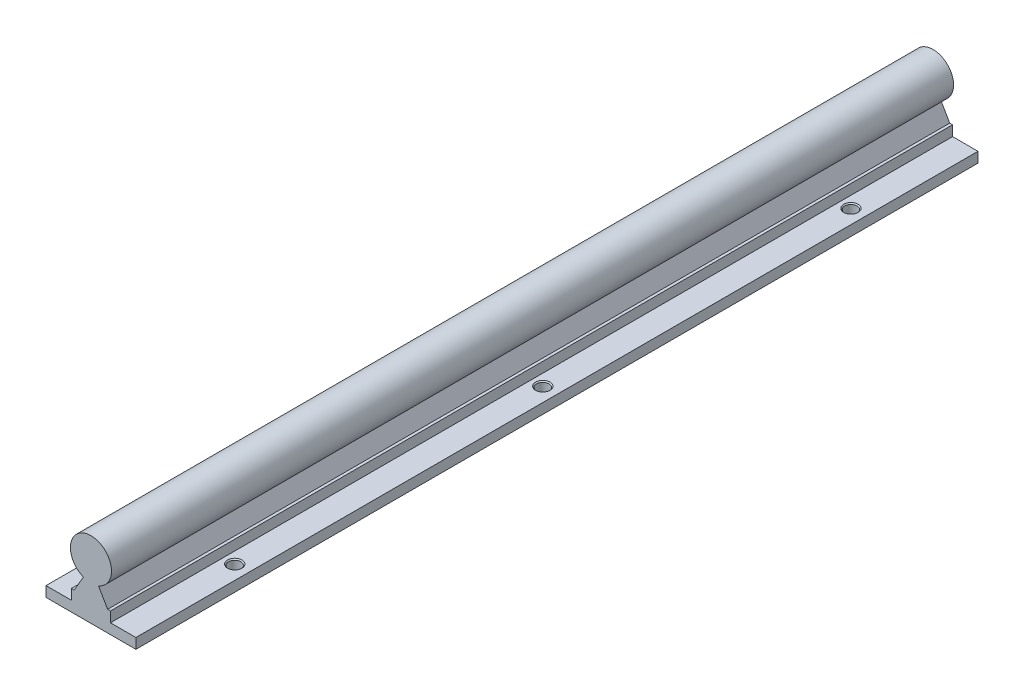
ISO-10303-21;
HEADER;
FILE_DESCRIPTION(('STEP AP214'),'2;1');
FILE_NAME('part.step','',(''),(''),'','','');
FILE_SCHEMA(('AUTOMOTIVE_DESIGN { 1 0 10303 214 1 1 1 1 }'));
ENDSEC;
DATA;
#1=APPLICATION_CONTEXT('core data for automotive mechanical design processes');
#2=APPLICATION_PROTOCOL_DEFINITION('international standard','automotive_design',2000,#1);
#3=PRODUCT_CONTEXT('',#1,'mechanical');
#4=PRODUCT('Part','Part','',(#3));
#5=PRODUCT_RELATED_PRODUCT_CATEGORY('part','',(#4));
#6=PRODUCT_DEFINITION_FORMATION('','',#4);
#7=PRODUCT_DEFINITION_CONTEXT('part definition',#1,'design');
#8=PRODUCT_DEFINITION('design','',#6,#7);
#9=PRODUCT_DEFINITION_SHAPE('','',#8);
#10=(LENGTH_UNIT() NAMED_UNIT(*) SI_UNIT(.MILLI.,.METRE.));
#11=(NAMED_UNIT(*) PLANE_ANGLE_UNIT() SI_UNIT($,.RADIAN.));
#12=(NAMED_UNIT(*) SI_UNIT($,.STERADIAN.) SOLID_ANGLE_UNIT());
#13=UNCERTAINTY_MEASURE_WITH_UNIT(LENGTH_MEASURE(1.E-05),#10,'distance_accuracy_value','');
#14=(GEOMETRIC_REPRESENTATION_CONTEXT(3) GLOBAL_UNCERTAINTY_ASSIGNED_CONTEXT((#13)) GLOBAL_UNIT_ASSIGNED_CONTEXT((#10,
#11,#12)) REPRESENTATION_CONTEXT('',''));
#15=CARTESIAN_POINT('',(0.,0.,0.));
#16=DIRECTION('',(0.,0.,1.));
#17=DIRECTION('',(1.,0.,0.));
#18=AXIS2_PLACEMENT_3D('',#15,#16,#17);
#19=CARTESIAN_POINT('',(-8.12119226265795,10.,205.));
#20=DIRECTION('',(0.,-1.,0.));
#21=DIRECTION('',(0.,0.,-1.));
#22=AXIS2_PLACEMENT_3D('',#19,#20,#21);
#23=PLANE('',#22);
#24=DIRECTION('',(-1.,0.,0.));
#25=VECTOR('',#24,1.);
#26=CARTESIAN_POINT('',(-8.12119226265795,10.,-205.));
#27=LINE('',#26,#25);
#28=CARTESIAN_POINT('',(-8.12119226265795,10.,-205.));
#29=VERTEX_POINT('',#28);
#30=CARTESIAN_POINT('',(-9.5,10.,-205.));
#31=VERTEX_POINT('',#30);
#32=EDGE_CURVE('E163',#29,#31,#27,.T.);
#33=ORIENTED_EDGE('',*,*,#32,.T.);
#34=DIRECTION('',(0.,0.,-1.));
#35=VECTOR('',#34,1.);
#36=CARTESIAN_POINT('',(-9.5,10.,205.));
#37=LINE('',#36,#35);
#38=CARTESIAN_POINT('',(-9.5,10.,205.));
#39=VERTEX_POINT('',#38);
#40=EDGE_CURVE('E211',#39,#31,#37,.T.);
#41=ORIENTED_EDGE('',*,*,#40,.F.);
#42=DIRECTION('',(-1.,0.,0.));
#43=VECTOR('',#42,1.);
#44=CARTESIAN_POINT('',(-8.12119226265795,10.,205.));
#45=LINE('',#44,#43);
#46=CARTESIAN_POINT('',(-8.12119226265795,10.,205.));
#47=VERTEX_POINT('',#46);
#48=EDGE_CURVE('E186',#47,#39,#45,.T.);
#49=ORIENTED_EDGE('',*,*,#48,.F.);
#50=DIRECTION('',(0.,0.,-1.));
#51=VECTOR('',#50,1.);
#52=CARTESIAN_POINT('',(-8.12119226265795,10.,205.));
#53=LINE('',#52,#51);
#54=EDGE_CURVE('E159',#47,#29,#53,.T.);
#55=ORIENTED_EDGE('',*,*,#54,.T.);
#56=EDGE_LOOP('',(#33,#41,#49,#55));
#57=FACE_BOUND('',#56,.T.);
#58=ADVANCED_FACE('F40',(#57),#23,.F.);
#59=CARTESIAN_POINT('',(-9.5,10.,205.));
#60=DIRECTION('',(1.,0.,0.));
#61=DIRECTION('',(0.,1.,0.));
#62=AXIS2_PLACEMENT_3D('',#59,#60,#61);
#63=PLANE('',#62);
#64=DIRECTION('',(0.,-1.,0.));
#65=VECTOR('',#64,1.);
#66=CARTESIAN_POINT('',(-9.5,10.,-205.));
#67=LINE('',#66,#65);
#68=CARTESIAN_POINT('',(-9.5,5.,-205.));
#69=VERTEX_POINT('',#68);
#70=EDGE_CURVE('E166',#31,#69,#67,.T.);
#71=ORIENTED_EDGE('',*,*,#70,.T.);
#72=DIRECTION('',(0.,0.,-1.));
#73=VECTOR('',#72,1.);
#74=CARTESIAN_POINT('',(-9.5,5.,205.));
#75=LINE('',#74,#73);
#76=CARTESIAN_POINT('',(-9.5,5.,205.));
#77=VERTEX_POINT('',#76);
#78=EDGE_CURVE('E208',#77,#69,#75,.T.);
#79=ORIENTED_EDGE('',*,*,#78,.F.);
#80=DIRECTION('',(0.,-1.,0.));
#81=VECTOR('',#80,1.);
#82=CARTESIAN_POINT('',(-9.5,10.,205.));
#83=LINE('',#82,#81);
#84=EDGE_CURVE('E114',#39,#77,#83,.T.);
#85=ORIENTED_EDGE('',*,*,#84,.F.);
#86=ORIENTED_EDGE('',*,*,#40,.T.);
#87=EDGE_LOOP('',(#71,#79,#85,#86));
#88=FACE_BOUND('',#87,.T.);
#89=ADVANCED_FACE('F263',(#88),#63,.F.);
#90=CARTESIAN_POINT('',(-9.5,5.,205.));
#91=DIRECTION('',(0.,-1.,0.));
#92=DIRECTION('',(1.,0.,0.));
#93=AXIS2_PLACEMENT_3D('',#90,#91,#92);
#94=PLANE('',#93);
#95=CARTESIAN_POINT('',(-15.,5.,150.));
#96=DIRECTION('',(0.,-1.,0.));
#97=DIRECTION('',(1.,0.,0.));
#98=AXIS2_PLACEMENT_3D('',#95,#96,#97);
#99=CIRCLE('',#98,3.50000000000056);
#100=CARTESIAN_POINT('',(-11.4999999999994,5.,150.));
#101=VERTEX_POINT('',#100);
#102=EDGE_CURVE('E222',#101,#101,#99,.T.);
#103=ORIENTED_EDGE('',*,*,#102,.T.);
#104=EDGE_LOOP('',(#103));
#105=FACE_BOUND('',#104,.T.);
#106=CARTESIAN_POINT('',(-15.,5.,0.));
#107=DIRECTION('',(0.,-1.,0.));
#108=DIRECTION('',(1.,0.,0.));
#109=AXIS2_PLACEMENT_3D('',#106,#107,#108);
#110=CIRCLE('',#109,3.50000000000056);
#111=CARTESIAN_POINT('',(-11.4999999999994,5.,0.));
#112=VERTEX_POINT('',#111);
#113=EDGE_CURVE('E219',#112,#112,#110,.T.);
#114=ORIENTED_EDGE('',*,*,#113,.T.);
#115=EDGE_LOOP('',(#114));
#116=FACE_BOUND('',#115,.T.);
#117=CARTESIAN_POINT('',(-15.,5.,-150.));
#118=DIRECTION('',(0.,-1.,0.));
#119=DIRECTION('',(1.,0.,0.));
#120=AXIS2_PLACEMENT_3D('',#117,#118,#119);
#121=CIRCLE('',#120,3.50000000000001);
#122=CARTESIAN_POINT('',(-11.4999999999999,5.,-150.));
#123=VERTEX_POINT('',#122);
#124=EDGE_CURVE('E216',#123,#123,#121,.T.);
#125=ORIENTED_EDGE('',*,*,#124,.T.);
#126=EDGE_LOOP('',(#125));
#127=FACE_BOUND('',#126,.T.);
#128=DIRECTION('',(-1.,0.,0.));
#129=VECTOR('',#128,1.);
#130=CARTESIAN_POINT('',(-9.5,5.,-205.));
#131=LINE('',#130,#129);
#132=CARTESIAN_POINT('',(-21.88,5.,-205.));
#133=VERTEX_POINT('',#132);
#134=EDGE_CURVE('E169',#69,#133,#131,.T.);
#135=ORIENTED_EDGE('',*,*,#134,.T.);
#136=DIRECTION('',(0.,0.,-1.));
#137=VECTOR('',#136,1.);
#138=CARTESIAN_POINT('',(-21.88,5.,205.));
#139=LINE('',#138,#137);
#140=CARTESIAN_POINT('',(-21.88,5.,205.));
#141=VERTEX_POINT('',#140);
#142=EDGE_CURVE('E205',#141,#133,#139,.T.);
#143=ORIENTED_EDGE('',*,*,#142,.F.);
#144=DIRECTION('',(-1.,0.,0.));
#145=VECTOR('',#144,1.);
#146=CARTESIAN_POINT('',(-9.5,5.,205.));
#147=LINE('',#146,#145);
#148=EDGE_CURVE('E333',#77,#141,#147,.T.);
#149=ORIENTED_EDGE('',*,*,#148,.F.);
#150=ORIENTED_EDGE('',*,*,#78,.T.);
#151=EDGE_LOOP('',(#135,#143,#149,#150));
#152=FACE_BOUND('',#151,.T.);
#153=ADVANCED_FACE('F269',(#105,#116,#127,#152),#94,.F.);
#154=CARTESIAN_POINT('',(-21.88,5.,205.));
#155=DIRECTION('',(1.,0.,0.));
#156=DIRECTION('',(0.,0.,-1.));
#157=AXIS2_PLACEMENT_3D('',#154,#155,#156);
#158=PLANE('',#157);
#159=DIRECTION('',(0.,-1.,0.));
#160=VECTOR('',#159,1.);
#161=CARTESIAN_POINT('',(-21.88,5.,-205.));
#162=LINE('',#161,#160);
#163=CARTESIAN_POINT('',(-21.88,0.,-205.));
#164=VERTEX_POINT('',#163);
#165=EDGE_CURVE('E171',#133,#164,#162,.T.);
#166=ORIENTED_EDGE('',*,*,#165,.T.);
#167=DIRECTION('',(0.,0.,-1.));
#168=VECTOR('',#167,1.);
#169=CARTESIAN_POINT('',(-21.88,0.,205.));
#170=LINE('',#169,#168);
#171=CARTESIAN_POINT('',(-21.88,0.,205.));
#172=VERTEX_POINT('',#171);
#173=EDGE_CURVE('E202',#172,#164,#170,.T.);
#174=ORIENTED_EDGE('',*,*,#173,.F.);
#175=DIRECTION('',(0.,-1.,0.));
#176=VECTOR('',#175,1.);
#177=CARTESIAN_POINT('',(-21.88,5.,205.));
#178=LINE('',#177,#176);
#179=EDGE_CURVE('E335',#141,#172,#178,.T.);
#180=ORIENTED_EDGE('',*,*,#179,.F.);
#181=ORIENTED_EDGE('',*,*,#142,.T.);
#182=EDGE_LOOP('',(#166,#174,#180,#181));
#183=FACE_BOUND('',#182,.T.);
#184=ADVANCED_FACE('F388',(#183),#158,.F.);
#185=CARTESIAN_POINT('',(-21.88,0.,205.));
#186=DIRECTION('',(0.,1.,0.));
#187=DIRECTION('',(0.,0.,1.));
#188=AXIS2_PLACEMENT_3D('',#185,#186,#187);
#189=PLANE('',#188);
#190=CARTESIAN_POINT('',(-15.,0.,150.));
#191=DIRECTION('',(0.,-1.,0.));
#192=DIRECTION('',(0.,0.,-1.));
#193=AXIS2_PLACEMENT_3D('',#190,#191,#192);
#194=CIRCLE('',#193,3.00000000000053);
#195=CARTESIAN_POINT('',(-15.,0.,146.999999999999));
#196=VERTEX_POINT('',#195);
#197=EDGE_CURVE('E321',#196,#196,#194,.T.);
#198=ORIENTED_EDGE('',*,*,#197,.F.);
#199=EDGE_LOOP('',(#198));
#200=FACE_BOUND('',#199,.T.);
#201=CARTESIAN_POINT('',(-15.,0.,0.));
#202=DIRECTION('',(0.,-1.,0.));
#203=DIRECTION('',(0.,0.,-1.));
#204=AXIS2_PLACEMENT_3D('',#201,#202,#203);
#205=CIRCLE('',#204,3.00000000000053);
#206=CARTESIAN_POINT('',(-15.,0.,-3.00000000000053));
#207=VERTEX_POINT('',#206);
#208=EDGE_CURVE('E324',#207,#207,#205,.T.);
#209=ORIENTED_EDGE('',*,*,#208,.F.);
#210=EDGE_LOOP('',(#209));
#211=FACE_BOUND('',#210,.T.);
#212=CARTESIAN_POINT('',(15.,0.,0.));
#213=DIRECTION('',(0.,-1.,0.));
#214=DIRECTION('',(0.,0.,-1.));
#215=AXIS2_PLACEMENT_3D('',#212,#213,#214);
#216=CIRCLE('',#215,2.99999999999948);
#217=CARTESIAN_POINT('',(15.,0.,-2.99999999999948));
#218=VERTEX_POINT('',#217);
#219=EDGE_CURVE('E318',#218,#218,#216,.T.);
#220=ORIENTED_EDGE('',*,*,#219,.F.);
#221=EDGE_LOOP('',(#220));
#222=FACE_BOUND('',#221,.T.);
#223=CARTESIAN_POINT('',(15.,0.,-150.));
#224=DIRECTION('',(0.,-1.,0.));
#225=DIRECTION('',(0.,0.,-1.));
#226=AXIS2_PLACEMENT_3D('',#223,#224,#225);
#227=CIRCLE('',#226,3.00000000000001);
#228=CARTESIAN_POINT('',(15.,0.,-153.));
#229=VERTEX_POINT('',#228);
#230=EDGE_CURVE('E315',#229,#229,#227,.T.);
#231=ORIENTED_EDGE('',*,*,#230,.F.);
#232=EDGE_LOOP('',(#231));
#233=FACE_BOUND('',#232,.T.);
#234=CARTESIAN_POINT('',(-15.,0.,-150.));
#235=DIRECTION('',(0.,-1.,0.));
#236=DIRECTION('',(0.,0.,-1.));
#237=AXIS2_PLACEMENT_3D('',#234,#235,#236);
#238=CIRCLE('',#237,3.00000000000001);
#239=CARTESIAN_POINT('',(-15.,0.,-153.));
#240=VERTEX_POINT('',#239);
#241=EDGE_CURVE('E313',#240,#240,#238,.T.);
#242=ORIENTED_EDGE('',*,*,#241,.F.);
#243=EDGE_LOOP('',(#242));
#244=FACE_BOUND('',#243,.T.);
#245=CARTESIAN_POINT('',(15.,0.,150.));
#246=DIRECTION('',(0.,-1.,0.));
#247=DIRECTION('',(0.,0.,-1.));
#248=AXIS2_PLACEMENT_3D('',#245,#246,#247);
#249=CIRCLE('',#248,2.99999999999947);
#250=CARTESIAN_POINT('',(15.,0.,147.000000000001));
#251=VERTEX_POINT('',#250);
#252=EDGE_CURVE('E167',#251,#251,#249,.T.);
#253=ORIENTED_EDGE('',*,*,#252,.F.);
#254=EDGE_LOOP('',(#253));
#255=FACE_BOUND('',#254,.T.);
#256=DIRECTION('',(1.,0.,0.));
#257=VECTOR('',#256,1.);
#258=CARTESIAN_POINT('',(-21.88,0.,-205.));
#259=LINE('',#258,#257);
#260=CARTESIAN_POINT('',(21.88,0.,-205.));
#261=VERTEX_POINT('',#260);
#262=EDGE_CURVE('E173',#164,#261,#259,.T.);
#263=ORIENTED_EDGE('',*,*,#262,.T.);
#264=DIRECTION('',(0.,0.,-1.));
#265=VECTOR('',#264,1.);
#266=CARTESIAN_POINT('',(21.88,0.,205.));
#267=LINE('',#266,#265);
#268=CARTESIAN_POINT('',(21.88,0.,205.));
#269=VERTEX_POINT('',#268);
#270=EDGE_CURVE('E199',#269,#261,#267,.T.);
#271=ORIENTED_EDGE('',*,*,#270,.F.);
#272=DIRECTION('',(1.,0.,0.));
#273=VECTOR('',#272,1.);
#274=CARTESIAN_POINT('',(-21.88,0.,205.));
#275=LINE('',#274,#273);
#276=EDGE_CURVE('E337',#172,#269,#275,.T.);
#277=ORIENTED_EDGE('',*,*,#276,.F.);
#278=ORIENTED_EDGE('',*,*,#173,.T.);
#279=EDGE_LOOP('',(#263,#271,#277,#278));
#280=FACE_BOUND('',#279,.T.);
#281=ADVANCED_FACE('F384',(#200,#211,#222,#233,#244,#255,#280),#189,.F.);
#282=CARTESIAN_POINT('',(21.88,5.,205.));
#283=DIRECTION('',(-1.,0.,0.));
#284=DIRECTION('',(0.,0.,1.));
#285=AXIS2_PLACEMENT_3D('',#282,#283,#284);
#286=PLANE('',#285);
#287=DIRECTION('',(0.,1.,0.));
#288=VECTOR('',#287,1.);
#289=CARTESIAN_POINT('',(21.88,5.,-205.));
#290=LINE('',#289,#288);
#291=CARTESIAN_POINT('',(21.88,5.,-205.));
#292=VERTEX_POINT('',#291);
#293=EDGE_CURVE('E175',#261,#292,#290,.T.);
#294=ORIENTED_EDGE('',*,*,#293,.T.);
#295=DIRECTION('',(0.,0.,-1.));
#296=VECTOR('',#295,1.);
#297=CARTESIAN_POINT('',(21.88,5.,205.));
#298=LINE('',#297,#296);
#299=CARTESIAN_POINT('',(21.88,5.,205.));
#300=VERTEX_POINT('',#299);
#301=EDGE_CURVE('E196',#300,#292,#298,.T.);
#302=ORIENTED_EDGE('',*,*,#301,.F.);
#303=DIRECTION('',(0.,1.,0.));
#304=VECTOR('',#303,1.);
#305=CARTESIAN_POINT('',(21.88,5.,205.));
#306=LINE('',#305,#304);
#307=EDGE_CURVE('E339',#269,#300,#306,.T.);
#308=ORIENTED_EDGE('',*,*,#307,.F.);
#309=ORIENTED_EDGE('',*,*,#270,.T.);
#310=EDGE_LOOP('',(#294,#302,#308,#309));
#311=FACE_BOUND('',#310,.T.);
#312=ADVANCED_FACE('F380',(#311),#286,.F.);
#313=CARTESIAN_POINT('',(9.5,5.,205.));
#314=DIRECTION('',(0.,-1.,0.));
#315=DIRECTION('',(1.,0.,0.));
#316=AXIS2_PLACEMENT_3D('',#313,#314,#315);
#317=PLANE('',#316);
#318=CARTESIAN_POINT('',(15.,5.,-150.));
#319=DIRECTION('',(0.,-1.,0.));
#320=DIRECTION('',(1.,0.,0.));
#321=AXIS2_PLACEMENT_3D('',#318,#319,#320);
#322=CIRCLE('',#321,3.5);
#323=CARTESIAN_POINT('',(18.5,5.,-150.));
#324=VERTEX_POINT('',#323);
#325=EDGE_CURVE('E240',#324,#324,#322,.T.);
#326=ORIENTED_EDGE('',*,*,#325,.T.);
#327=EDGE_LOOP('',(#326));
#328=FACE_BOUND('',#327,.T.);
#329=CARTESIAN_POINT('',(15.,5.,0.));
#330=DIRECTION('',(0.,-1.,0.));
#331=DIRECTION('',(1.,0.,0.));
#332=AXIS2_PLACEMENT_3D('',#329,#330,#331);
#333=CIRCLE('',#332,3.49999999999945);
#334=CARTESIAN_POINT('',(18.4999999999995,5.,0.));
#335=VERTEX_POINT('',#334);
#336=EDGE_CURVE('E237',#335,#335,#333,.T.);
#337=ORIENTED_EDGE('',*,*,#336,.T.);
#338=EDGE_LOOP('',(#337));
#339=FACE_BOUND('',#338,.T.);
#340=CARTESIAN_POINT('',(15.,5.,150.));
#341=DIRECTION('',(0.,-1.,0.));
#342=DIRECTION('',(1.,0.,0.));
#343=AXIS2_PLACEMENT_3D('',#340,#341,#342);
#344=CIRCLE('',#343,3.49999999999945);
#345=CARTESIAN_POINT('',(18.4999999999994,5.,150.));
#346=VERTEX_POINT('',#345);
#347=EDGE_CURVE('E234',#346,#346,#344,.T.);
#348=ORIENTED_EDGE('',*,*,#347,.T.);
#349=EDGE_LOOP('',(#348));
#350=FACE_BOUND('',#349,.T.);
#351=DIRECTION('',(-1.,0.,0.));
#352=VECTOR('',#351,1.);
#353=CARTESIAN_POINT('',(9.5,5.,-205.));
#354=LINE('',#353,#352);
#355=CARTESIAN_POINT('',(9.5,5.,-205.));
#356=VERTEX_POINT('',#355);
#357=EDGE_CURVE('E177',#292,#356,#354,.T.);
#358=ORIENTED_EDGE('',*,*,#357,.T.);
#359=DIRECTION('',(0.,0.,-1.));
#360=VECTOR('',#359,1.);
#361=CARTESIAN_POINT('',(9.5,5.,205.));
#362=LINE('',#361,#360);
#363=CARTESIAN_POINT('',(9.5,5.,205.));
#364=VERTEX_POINT('',#363);
#365=EDGE_CURVE('E193',#364,#356,#362,.T.);
#366=ORIENTED_EDGE('',*,*,#365,.F.);
#367=DIRECTION('',(-1.,0.,0.));
#368=VECTOR('',#367,1.);
#369=CARTESIAN_POINT('',(9.5,5.,205.));
#370=LINE('',#369,#368);
#371=EDGE_CURVE('E341',#300,#364,#370,.T.);
#372=ORIENTED_EDGE('',*,*,#371,.F.);
#373=ORIENTED_EDGE('',*,*,#301,.T.);
#374=EDGE_LOOP('',(#358,#366,#372,#373));
#375=FACE_BOUND('',#374,.T.);
#376=ADVANCED_FACE('F377',(#328,#339,#350,#375),#317,.F.);
#377=CARTESIAN_POINT('',(9.5,10.,205.));
#378=DIRECTION('',(-1.,0.,0.));
#379=DIRECTION('',(0.,-1.,0.));
#380=AXIS2_PLACEMENT_3D('',#377,#378,#379);
#381=PLANE('',#380);
#382=DIRECTION('',(0.,1.,0.));
#383=VECTOR('',#382,1.);
#384=CARTESIAN_POINT('',(9.5,10.,-205.));
#385=LINE('',#384,#383);
#386=CARTESIAN_POINT('',(9.5,10.,-205.));
#387=VERTEX_POINT('',#386);
#388=EDGE_CURVE('E179',#356,#387,#385,.T.);
#389=ORIENTED_EDGE('',*,*,#388,.T.);
#390=DIRECTION('',(0.,0.,-1.));
#391=VECTOR('',#390,1.);
#392=CARTESIAN_POINT('',(9.5,10.,205.));
#393=LINE('',#392,#391);
#394=CARTESIAN_POINT('',(9.5,10.,205.));
#395=VERTEX_POINT('',#394);
#396=EDGE_CURVE('E190',#395,#387,#393,.T.);
#397=ORIENTED_EDGE('',*,*,#396,.F.);
#398=DIRECTION('',(0.,1.,0.));
#399=VECTOR('',#398,1.);
#400=CARTESIAN_POINT('',(9.5,10.,205.));
#401=LINE('',#400,#399);
#402=EDGE_CURVE('E343',#364,#395,#401,.T.);
#403=ORIENTED_EDGE('',*,*,#402,.F.);
#404=ORIENTED_EDGE('',*,*,#365,.T.);
#405=EDGE_LOOP('',(#389,#397,#403,#404));
#406=FACE_BOUND('',#405,.T.);
#407=ADVANCED_FACE('F349',(#406),#381,.F.);
#408=CARTESIAN_POINT('',(8.12119226265795,10.,205.));
#409=DIRECTION('',(0.,-1.,0.));
#410=DIRECTION('',(0.,0.,-1.));
#411=AXIS2_PLACEMENT_3D('',#408,#409,#410);
#412=PLANE('',#411);
#413=DIRECTION('',(-1.,0.,0.));
#414=VECTOR('',#413,1.);
#415=CARTESIAN_POINT('',(8.12119226265795,10.,-205.));
#416=LINE('',#415,#414);
#417=CARTESIAN_POINT('',(8.12119226265795,10.,-205.));
#418=VERTEX_POINT('',#417);
#419=EDGE_CURVE('E181',#387,#418,#416,.T.);
#420=ORIENTED_EDGE('',*,*,#419,.T.);
#421=DIRECTION('',(0.,0.,-1.));
#422=VECTOR('',#421,1.);
#423=CARTESIAN_POINT('',(8.12119226265795,10.,205.));
#424=LINE('',#423,#422);
#425=CARTESIAN_POINT('',(8.12119226265795,10.,205.));
#426=VERTEX_POINT('',#425);
#427=EDGE_CURVE('E154',#426,#418,#424,.T.);
#428=ORIENTED_EDGE('',*,*,#427,.F.);
#429=DIRECTION('',(-1.,0.,0.));
#430=VECTOR('',#429,1.);
#431=CARTESIAN_POINT('',(8.12119226265795,10.,205.));
#432=LINE('',#431,#430);
#433=EDGE_CURVE('E145',#395,#426,#432,.T.);
#434=ORIENTED_EDGE('',*,*,#433,.F.);
#435=ORIENTED_EDGE('',*,*,#396,.T.);
#436=EDGE_LOOP('',(#420,#428,#434,#435));
#437=FACE_BOUND('',#436,.T.);
#438=ADVANCED_FACE('F353',(#437),#412,.F.);
#439=CARTESIAN_POINT('',(8.12119226265795,10.,205.));
#440=DIRECTION('',(-0.866025403784438,-0.500000000000001,0.));
#441=DIRECTION('',(0.500000000000001,-0.866025403784438,0.));
#442=AXIS2_PLACEMENT_3D('',#439,#440,#441);
#443=PLANE('',#442);
#444=DIRECTION('',(-0.500000000000001,0.866025403784438,0.));
#445=VECTOR('',#444,1.);
#446=CARTESIAN_POINT('',(8.12119226265795,10.,-205.));
#447=LINE('',#446,#445);
#448=CARTESIAN_POINT('',(3.67559518989782,17.7,-205.));
#449=VERTEX_POINT('',#448);
#450=EDGE_CURVE('E153',#418,#449,#447,.T.);
#451=ORIENTED_EDGE('',*,*,#450,.T.);
#452=DIRECTION('',(0.,0.,-1.));
#453=VECTOR('',#452,1.);
#454=CARTESIAN_POINT('',(3.67559518989782,17.7,205.));
#455=LINE('',#454,#453);
#456=CARTESIAN_POINT('',(3.67559518989782,17.7,205.));
#457=VERTEX_POINT('',#456);
#458=EDGE_CURVE('E150',#457,#449,#455,.T.);
#459=ORIENTED_EDGE('',*,*,#458,.F.);
#460=DIRECTION('',(-0.500000000000001,0.866025403784438,0.));
#461=VECTOR('',#460,1.);
#462=CARTESIAN_POINT('',(8.12119226265795,10.,205.));
#463=LINE('',#462,#461);
#464=EDGE_CURVE('E139',#426,#457,#463,.T.);
#465=ORIENTED_EDGE('',*,*,#464,.F.);
#466=ORIENTED_EDGE('',*,*,#427,.T.);
#467=EDGE_LOOP('',(#451,#459,#465,#466));
#468=FACE_BOUND('',#467,.T.);
#469=ADVANCED_FACE('F151',(#468),#443,.F.);
#470=CARTESIAN_POINT('',(0.,27.,205.));
#471=DIRECTION('',(0.,0.,-1.));
#472=DIRECTION('',(-1.,0.,0.));
#473=AXIS2_PLACEMENT_3D('',#470,#471,#472);
#474=CYLINDRICAL_SURFACE('',#473,10.);
#475=CARTESIAN_POINT('',(0.,27.,-205.));
#476=DIRECTION('',(0.,0.,1.));
#477=DIRECTION('',(1.,0.,0.));
#478=AXIS2_PLACEMENT_3D('',#475,#476,#477);
#479=CIRCLE('',#478,10.);
#480=CARTESIAN_POINT('',(-3.67559518989782,17.7,-205.));
#481=VERTEX_POINT('',#480);
#482=EDGE_CURVE('E99',#449,#481,#479,.T.);
#483=ORIENTED_EDGE('',*,*,#482,.T.);
#484=DIRECTION('',(0.,0.,-1.));
#485=VECTOR('',#484,1.);
#486=CARTESIAN_POINT('',(-3.67559518989782,17.7,205.));
#487=LINE('',#486,#485);
#488=CARTESIAN_POINT('',(-3.67559518989782,17.7,205.));
#489=VERTEX_POINT('',#488);
#490=EDGE_CURVE('E155',#489,#481,#487,.T.);
#491=ORIENTED_EDGE('',*,*,#490,.F.);
#492=CARTESIAN_POINT('',(0.,27.,205.));
#493=DIRECTION('',(0.,0.,1.));
#494=DIRECTION('',(1.,0.,0.));
#495=AXIS2_PLACEMENT_3D('',#492,#493,#494);
#496=CIRCLE('',#495,10.);
#497=EDGE_CURVE('E143',#457,#489,#496,.T.);
#498=ORIENTED_EDGE('',*,*,#497,.F.);
#499=ORIENTED_EDGE('',*,*,#458,.T.);
#500=EDGE_LOOP('',(#483,#491,#498,#499));
#501=FACE_BOUND('',#500,.T.);
#502=ADVANCED_FACE('F157',(#501),#474,.T.);
#503=CARTESIAN_POINT('',(-8.12119226265795,10.,205.));
#504=DIRECTION('',(0.866025403784438,-0.500000000000001,0.));
#505=DIRECTION('',(0.500000000000001,0.866025403784438,0.));
#506=AXIS2_PLACEMENT_3D('',#503,#504,#505);
#507=PLANE('',#506);
#508=DIRECTION('',(-0.500000000000001,-0.866025403784438,0.));
#509=VECTOR('',#508,1.);
#510=CARTESIAN_POINT('',(-8.12119226265795,10.,-205.));
#511=LINE('',#510,#509);
#512=EDGE_CURVE('E105',#481,#29,#511,.T.);
#513=ORIENTED_EDGE('',*,*,#512,.T.);
#514=ORIENTED_EDGE('',*,*,#54,.F.);
#515=DIRECTION('',(-0.500000000000001,-0.866025403784438,0.));
#516=VECTOR('',#515,1.);
#517=CARTESIAN_POINT('',(-8.12119226265795,10.,205.));
#518=LINE('',#517,#516);
#519=EDGE_CURVE('E58',#489,#47,#518,.T.);
#520=ORIENTED_EDGE('',*,*,#519,.F.);
#521=ORIENTED_EDGE('',*,*,#490,.T.);
#522=EDGE_LOOP('',(#513,#514,#520,#521));
#523=FACE_BOUND('',#522,.T.);
#524=ADVANCED_FACE('F360',(#523),#507,.F.);
#525=CARTESIAN_POINT('',(0.,27.,205.));
#526=DIRECTION('',(0.,0.,1.));
#527=DIRECTION('',(1.,0.,0.));
#528=AXIS2_PLACEMENT_3D('',#525,#526,#527);
#529=PLANE('',#528);
#530=ORIENTED_EDGE('',*,*,#48,.T.);
#531=ORIENTED_EDGE('',*,*,#84,.T.);
#532=ORIENTED_EDGE('',*,*,#148,.T.);
#533=ORIENTED_EDGE('',*,*,#179,.T.);
#534=ORIENTED_EDGE('',*,*,#276,.T.);
#535=ORIENTED_EDGE('',*,*,#307,.T.);
#536=ORIENTED_EDGE('',*,*,#371,.T.);
#537=ORIENTED_EDGE('',*,*,#402,.T.);
#538=ORIENTED_EDGE('',*,*,#433,.T.);
#539=ORIENTED_EDGE('',*,*,#464,.T.);
#540=ORIENTED_EDGE('',*,*,#497,.T.);
#541=ORIENTED_EDGE('',*,*,#519,.T.);
#542=EDGE_LOOP('',(#530,#531,#532,#533,#534,#535,#536,#537,#538,#539,#540,#541));
#543=FACE_BOUND('',#542,.T.);
#544=ADVANCED_FACE('F141',(#543),#529,.T.);
#545=CARTESIAN_POINT('',(0.,27.,-205.));
#546=DIRECTION('',(0.,0.,1.));
#547=DIRECTION('',(1.,0.,0.));
#548=AXIS2_PLACEMENT_3D('',#545,#546,#547);
#549=PLANE('',#548);
#550=ORIENTED_EDGE('',*,*,#32,.F.);
#551=ORIENTED_EDGE('',*,*,#512,.F.);
#552=ORIENTED_EDGE('',*,*,#482,.F.);
#553=ORIENTED_EDGE('',*,*,#450,.F.);
#554=ORIENTED_EDGE('',*,*,#419,.F.);
#555=ORIENTED_EDGE('',*,*,#388,.F.);
#556=ORIENTED_EDGE('',*,*,#357,.F.);
#557=ORIENTED_EDGE('',*,*,#293,.F.);
#558=ORIENTED_EDGE('',*,*,#262,.F.);
#559=ORIENTED_EDGE('',*,*,#165,.F.);
#560=ORIENTED_EDGE('',*,*,#134,.F.);
#561=ORIENTED_EDGE('',*,*,#70,.F.);
#562=EDGE_LOOP('',(#550,#551,#552,#553,#554,#555,#556,#557,#558,#559,#560,#561));
#563=FACE_BOUND('',#562,.T.);
#564=ADVANCED_FACE('F356',(#563),#549,.F.);
#565=CARTESIAN_POINT('',(15.,37.001,150.));
#566=DIRECTION('',(0.,-1.,0.));
#567=DIRECTION('',(0.,0.,-1.));
#568=AXIS2_PLACEMENT_3D('',#565,#566,#567);
#569=CYLINDRICAL_SURFACE('',#568,2.99999999999947);
#570=CARTESIAN_POINT('',(15.,4.50000000000001,150.));
#571=DIRECTION('',(0.,-1.,0.));
#572=DIRECTION('',(0.,0.,-1.));
#573=AXIS2_PLACEMENT_3D('',#570,#571,#572);
#574=CIRCLE('',#573,2.99999999999947);
#575=CARTESIAN_POINT('',(15.,4.50000000000001,147.000000000001));
#576=VERTEX_POINT('',#575);
#577=EDGE_CURVE('E11',#576,#576,#574,.F.);
#578=ORIENTED_EDGE('',*,*,#577,.T.);
#579=EDGE_LOOP('',(#578));
#580=FACE_BOUND('',#579,.T.);
#581=ORIENTED_EDGE('',*,*,#252,.T.);
#582=EDGE_LOOP('',(#581));
#583=FACE_BOUND('',#582,.T.);
#584=ADVANCED_FACE('F430',(#580,#583),#569,.F.);
#585=CARTESIAN_POINT('',(15.,37.001,-150.));
#586=DIRECTION('',(0.,-1.,0.));
#587=DIRECTION('',(0.,0.,-1.));
#588=AXIS2_PLACEMENT_3D('',#585,#586,#587);
#589=CYLINDRICAL_SURFACE('',#588,3.00000000000001);
#590=CARTESIAN_POINT('',(15.,4.50000000000005,-150.));
#591=DIRECTION('',(0.,-1.,0.));
#592=DIRECTION('',(0.,0.,-1.));
#593=AXIS2_PLACEMENT_3D('',#590,#591,#592);
#594=CIRCLE('',#593,3.00000000000001);
#595=CARTESIAN_POINT('',(15.,4.50000000000005,-153.));
#596=VERTEX_POINT('',#595);
#597=EDGE_CURVE('E231',#596,#596,#594,.F.);
#598=ORIENTED_EDGE('',*,*,#597,.T.);
#599=EDGE_LOOP('',(#598));
#600=FACE_BOUND('',#599,.T.);
#601=ORIENTED_EDGE('',*,*,#230,.T.);
#602=EDGE_LOOP('',(#601));
#603=FACE_BOUND('',#602,.T.);
#604=ADVANCED_FACE('F432',(#600,#603),#589,.F.);
#605=CARTESIAN_POINT('',(15.,37.001,0.));
#606=DIRECTION('',(0.,-1.,0.));
#607=DIRECTION('',(0.,0.,-1.));
#608=AXIS2_PLACEMENT_3D('',#605,#606,#607);
#609=CYLINDRICAL_SURFACE('',#608,2.99999999999948);
#610=CARTESIAN_POINT('',(15.,4.50000000000002,0.));
#611=DIRECTION('',(0.,-1.,0.));
#612=DIRECTION('',(0.,0.,-1.));
#613=AXIS2_PLACEMENT_3D('',#610,#611,#612);
#614=CIRCLE('',#613,2.99999999999948);
#615=CARTESIAN_POINT('',(15.,4.50000000000002,-2.99999999999948));
#616=VERTEX_POINT('',#615);
#617=EDGE_CURVE('E50',#616,#616,#614,.F.);
#618=ORIENTED_EDGE('',*,*,#617,.T.);
#619=EDGE_LOOP('',(#618));
#620=FACE_BOUND('',#619,.T.);
#621=ORIENTED_EDGE('',*,*,#219,.T.);
#622=EDGE_LOOP('',(#621));
#623=FACE_BOUND('',#622,.T.);
#624=ADVANCED_FACE('F245',(#620,#623),#609,.F.);
#625=CARTESIAN_POINT('',(-15.,37.001,-150.));
#626=DIRECTION('',(0.,-1.,0.));
#627=DIRECTION('',(0.,0.,-1.));
#628=AXIS2_PLACEMENT_3D('',#625,#626,#627);
#629=CYLINDRICAL_SURFACE('',#628,3.00000000000001);
#630=CARTESIAN_POINT('',(-15.,4.50000000000005,-150.));
#631=DIRECTION('',(0.,-1.,0.));
#632=DIRECTION('',(0.,0.,-1.));
#633=AXIS2_PLACEMENT_3D('',#630,#631,#632);
#634=CIRCLE('',#633,3.00000000000001);
#635=CARTESIAN_POINT('',(-15.,4.50000000000005,-153.));
#636=VERTEX_POINT('',#635);
#637=EDGE_CURVE('E228',#636,#636,#634,.F.);
#638=ORIENTED_EDGE('',*,*,#637,.T.);
#639=EDGE_LOOP('',(#638));
#640=FACE_BOUND('',#639,.T.);
#641=ORIENTED_EDGE('',*,*,#241,.T.);
#642=EDGE_LOOP('',(#641));
#643=FACE_BOUND('',#642,.T.);
#644=ADVANCED_FACE('F306',(#640,#643),#629,.F.);
#645=CARTESIAN_POINT('',(-15.,37.001,0.));
#646=DIRECTION('',(0.,-1.,0.));
#647=DIRECTION('',(0.,0.,-1.));
#648=AXIS2_PLACEMENT_3D('',#645,#646,#647);
#649=CYLINDRICAL_SURFACE('',#648,3.00000000000053);
#650=CARTESIAN_POINT('',(-15.,4.50000000000001,0.));
#651=DIRECTION('',(0.,-1.,0.));
#652=DIRECTION('',(0.,0.,-1.));
#653=AXIS2_PLACEMENT_3D('',#650,#651,#652);
#654=CIRCLE('',#653,3.00000000000053);
#655=CARTESIAN_POINT('',(-15.,4.50000000000001,-3.00000000000053));
#656=VERTEX_POINT('',#655);
#657=EDGE_CURVE('E225',#656,#656,#654,.F.);
#658=ORIENTED_EDGE('',*,*,#657,.T.);
#659=EDGE_LOOP('',(#658));
#660=FACE_BOUND('',#659,.T.);
#661=ORIENTED_EDGE('',*,*,#208,.T.);
#662=EDGE_LOOP('',(#661));
#663=FACE_BOUND('',#662,.T.);
#664=ADVANCED_FACE('F309',(#660,#663),#649,.F.);
#665=CARTESIAN_POINT('',(-15.,37.001,150.));
#666=DIRECTION('',(0.,-1.,0.));
#667=DIRECTION('',(0.,0.,-1.));
#668=AXIS2_PLACEMENT_3D('',#665,#666,#667);
#669=CYLINDRICAL_SURFACE('',#668,3.00000000000053);
#670=CARTESIAN_POINT('',(-15.,4.50000000000001,150.));
#671=DIRECTION('',(0.,-1.,0.));
#672=DIRECTION('',(0.,0.,-1.));
#673=AXIS2_PLACEMENT_3D('',#670,#671,#672);
#674=CIRCLE('',#673,3.00000000000053);
#675=CARTESIAN_POINT('',(-15.,4.50000000000001,146.999999999999));
#676=VERTEX_POINT('',#675);
#677=EDGE_CURVE('E213',#676,#676,#674,.F.);
#678=ORIENTED_EDGE('',*,*,#677,.T.);
#679=EDGE_LOOP('',(#678));
#680=FACE_BOUND('',#679,.T.);
#681=ORIENTED_EDGE('',*,*,#197,.T.);
#682=EDGE_LOOP('',(#681));
#683=FACE_BOUND('',#682,.T.);
#684=ADVANCED_FACE('F281',(#680,#683),#669,.F.);
#685=CARTESIAN_POINT('',(-15.,4.50000000000001,150.));
#686=DIRECTION('',(0.,1.,0.));
#687=DIRECTION('',(0.,0.,1.));
#688=AXIS2_PLACEMENT_3D('',#685,#686,#687);
#689=CONICAL_SURFACE('',#688,3.00000000000053,0.785398163397493);
#690=ORIENTED_EDGE('',*,*,#102,.F.);
#691=EDGE_LOOP('',(#690));
#692=FACE_BOUND('',#691,.T.);
#693=ORIENTED_EDGE('',*,*,#677,.F.);
#694=EDGE_LOOP('',(#693));
#695=FACE_BOUND('',#694,.T.);
#696=ADVANCED_FACE('F274',(#692,#695),#689,.F.);
#697=CARTESIAN_POINT('',(-15.,4.50000000000001,0.));
#698=DIRECTION('',(0.,1.,0.));
#699=DIRECTION('',(0.,0.,1.));
#700=AXIS2_PLACEMENT_3D('',#697,#698,#699);
#701=CONICAL_SURFACE('',#700,3.00000000000053,0.785398163397493);
#702=ORIENTED_EDGE('',*,*,#113,.F.);
#703=EDGE_LOOP('',(#702));
#704=FACE_BOUND('',#703,.T.);
#705=ORIENTED_EDGE('',*,*,#657,.F.);
#706=EDGE_LOOP('',(#705));
#707=FACE_BOUND('',#706,.T.);
#708=ADVANCED_FACE('F280',(#704,#707),#701,.F.);
#709=CARTESIAN_POINT('',(-15.,4.50000000000005,-150.));
#710=DIRECTION('',(0.,1.,0.));
#711=DIRECTION('',(0.,0.,1.));
#712=AXIS2_PLACEMENT_3D('',#709,#710,#711);
#713=CONICAL_SURFACE('',#712,3.00000000000001,0.785398163397495);
#714=ORIENTED_EDGE('',*,*,#124,.F.);
#715=EDGE_LOOP('',(#714));
#716=FACE_BOUND('',#715,.T.);
#717=ORIENTED_EDGE('',*,*,#637,.F.);
#718=EDGE_LOOP('',(#717));
#719=FACE_BOUND('',#718,.T.);
#720=ADVANCED_FACE('F257',(#716,#719),#713,.F.);
#721=CARTESIAN_POINT('',(15.,4.50000000000005,-150.));
#722=DIRECTION('',(0.,1.,0.));
#723=DIRECTION('',(0.,0.,1.));
#724=AXIS2_PLACEMENT_3D('',#721,#722,#723);
#725=CONICAL_SURFACE('',#724,3.00000000000001,0.785398163397496);
#726=ORIENTED_EDGE('',*,*,#325,.F.);
#727=EDGE_LOOP('',(#726));
#728=FACE_BOUND('',#727,.T.);
#729=ORIENTED_EDGE('',*,*,#597,.F.);
#730=EDGE_LOOP('',(#729));
#731=FACE_BOUND('',#730,.T.);
#732=ADVANCED_FACE('F250',(#728,#731),#725,.F.);
#733=CARTESIAN_POINT('',(15.,4.50000000000002,0.));
#734=DIRECTION('',(0.,1.,0.));
#735=DIRECTION('',(0.,0.,1.));
#736=AXIS2_PLACEMENT_3D('',#733,#734,#735);
#737=CONICAL_SURFACE('',#736,2.99999999999948,0.785398163397441);
#738=ORIENTED_EDGE('',*,*,#336,.F.);
#739=EDGE_LOOP('',(#738));
#740=FACE_BOUND('',#739,.T.);
#741=ORIENTED_EDGE('',*,*,#617,.F.);
#742=EDGE_LOOP('',(#741));
#743=FACE_BOUND('',#742,.T.);
#744=ADVANCED_FACE('F248',(#740,#743),#737,.F.);
#745=CARTESIAN_POINT('',(15.,4.50000000000001,150.));
#746=DIRECTION('',(0.,1.,0.));
#747=DIRECTION('',(0.,0.,1.));
#748=AXIS2_PLACEMENT_3D('',#745,#746,#747);
#749=CONICAL_SURFACE('',#748,2.99999999999947,0.785398163397441);
#750=ORIENTED_EDGE('',*,*,#347,.F.);
#751=EDGE_LOOP('',(#750));
#752=FACE_BOUND('',#751,.T.);
#753=ORIENTED_EDGE('',*,*,#577,.F.);
#754=EDGE_LOOP('',(#753));
#755=FACE_BOUND('',#754,.T.);
#756=ADVANCED_FACE('F43',(#752,#755),#749,.F.);
#757=CLOSED_SHELL('',(#58,#89,#153,#184,#281,#312,#376,#407,#438,#469,#502,#524,#544,#564,#584,
#604,#624,#644,#664,#684,#696,#708,#720,#732,#744,#756));
#758=MANIFOLD_SOLID_BREP('B2',#757);
#759=ADVANCED_BREP_SHAPE_REPRESENTATION('',(#18,#758),#14);
#760=SHAPE_DEFINITION_REPRESENTATION(#9,#759);
ENDSEC;
END-ISO-10303-21;
